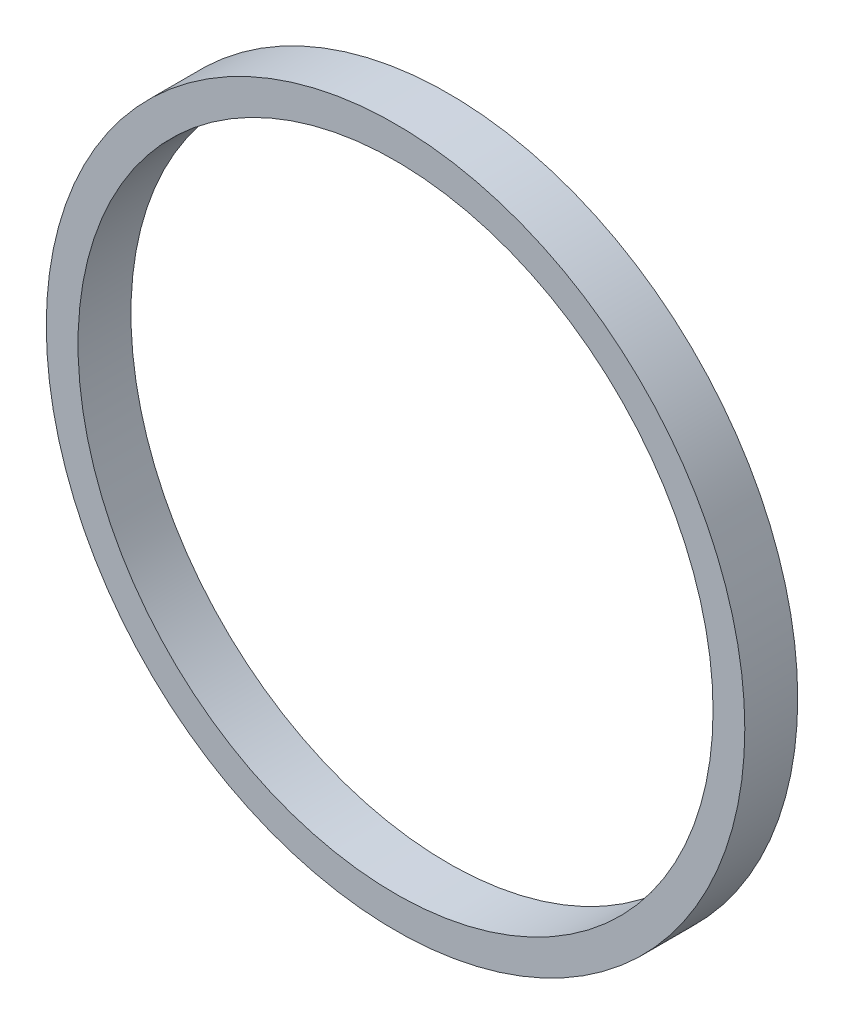
ISO-10303-21;
HEADER;
FILE_DESCRIPTION(('STEP AP214'),'2;1');
FILE_NAME('part.step','',(''),(''),'','','');
FILE_SCHEMA(('AUTOMOTIVE_DESIGN { 1 0 10303 214 1 1 1 1 }'));
ENDSEC;
DATA;
#1=APPLICATION_CONTEXT('core data for automotive mechanical design processes');
#2=APPLICATION_PROTOCOL_DEFINITION('international standard','automotive_design',2000,#1);
#3=PRODUCT_CONTEXT('',#1,'mechanical');
#4=PRODUCT('Part','Part','',(#3));
#5=PRODUCT_RELATED_PRODUCT_CATEGORY('part','',(#4));
#6=PRODUCT_DEFINITION_FORMATION('','',#4);
#7=PRODUCT_DEFINITION_CONTEXT('part definition',#1,'design');
#8=PRODUCT_DEFINITION('design','',#6,#7);
#9=PRODUCT_DEFINITION_SHAPE('','',#8);
#10=(LENGTH_UNIT() NAMED_UNIT(*) SI_UNIT(.MILLI.,.METRE.));
#11=(NAMED_UNIT(*) PLANE_ANGLE_UNIT() SI_UNIT($,.RADIAN.));
#12=(NAMED_UNIT(*) SI_UNIT($,.STERADIAN.) SOLID_ANGLE_UNIT());
#13=UNCERTAINTY_MEASURE_WITH_UNIT(LENGTH_MEASURE(1.E-05),#10,'distance_accuracy_value','');
#14=(GEOMETRIC_REPRESENTATION_CONTEXT(3) GLOBAL_UNCERTAINTY_ASSIGNED_CONTEXT((#13)) GLOBAL_UNIT_ASSIGNED_CONTEXT((#10,
#11,#12)) REPRESENTATION_CONTEXT('',''));
#15=CARTESIAN_POINT('',(0.,0.,0.));
#16=DIRECTION('',(0.,0.,1.));
#17=DIRECTION('',(1.,0.,0.));
#18=AXIS2_PLACEMENT_3D('',#15,#16,#17);
#19=CARTESIAN_POINT('',(-0.745995021380313,0.,5.));
#20=DIRECTION('',(0.,0.,1.));
#21=DIRECTION('',(1.,0.,0.));
#22=AXIS2_PLACEMENT_3D('',#19,#20,#21);
#23=PLANE('',#22);
#24=CARTESIAN_POINT('',(-0.745995021380313,0.,5.));
#25=DIRECTION('',(0.,0.,1.));
#26=DIRECTION('',(1.,0.,0.));
#27=AXIS2_PLACEMENT_3D('',#24,#25,#26);
#28=CIRCLE('',#27,33.);
#29=CARTESIAN_POINT('',(32.2540049786197,0.,5.));
#30=VERTEX_POINT('',#29);
#31=EDGE_CURVE('E10',#30,#30,#28,.T.);
#32=ORIENTED_EDGE('',*,*,#31,.T.);
#33=EDGE_LOOP('',(#32));
#34=FACE_BOUND('',#33,.T.);
#35=CARTESIAN_POINT('',(-0.745995021380313,0.,5.));
#36=DIRECTION('',(0.,0.,1.));
#37=DIRECTION('',(1.,0.,0.));
#38=AXIS2_PLACEMENT_3D('',#35,#36,#37);
#39=CIRCLE('',#38,30.);
#40=CARTESIAN_POINT('',(29.2540049786197,0.,5.));
#41=VERTEX_POINT('',#40);
#42=EDGE_CURVE('E48',#41,#41,#39,.T.);
#43=ORIENTED_EDGE('',*,*,#42,.F.);
#44=EDGE_LOOP('',(#43));
#45=FACE_BOUND('',#44,.T.);
#46=ADVANCED_FACE('F40',(#34,#45),#23,.T.);
#47=CARTESIAN_POINT('',(-0.745995021380313,0.,0.));
#48=DIRECTION('',(0.,0.,1.));
#49=DIRECTION('',(1.,0.,0.));
#50=AXIS2_PLACEMENT_3D('',#47,#48,#49);
#51=PLANE('',#50);
#52=CARTESIAN_POINT('',(-0.745995021380313,0.,0.));
#53=DIRECTION('',(0.,0.,1.));
#54=DIRECTION('',(1.,0.,0.));
#55=AXIS2_PLACEMENT_3D('',#52,#53,#54);
#56=CIRCLE('',#55,33.);
#57=CARTESIAN_POINT('',(32.2540049786197,0.,0.));
#58=VERTEX_POINT('',#57);
#59=EDGE_CURVE('E41',#58,#58,#56,.T.);
#60=ORIENTED_EDGE('',*,*,#59,.F.);
#61=EDGE_LOOP('',(#60));
#62=FACE_BOUND('',#61,.T.);
#63=CARTESIAN_POINT('',(-0.745995021380313,0.,0.));
#64=DIRECTION('',(0.,0.,1.));
#65=DIRECTION('',(1.,0.,0.));
#66=AXIS2_PLACEMENT_3D('',#63,#64,#65);
#67=CIRCLE('',#66,30.);
#68=CARTESIAN_POINT('',(29.2540049786197,0.,0.));
#69=VERTEX_POINT('',#68);
#70=EDGE_CURVE('E49',#69,#69,#67,.T.);
#71=ORIENTED_EDGE('',*,*,#70,.T.);
#72=EDGE_LOOP('',(#71));
#73=FACE_BOUND('',#72,.T.);
#74=ADVANCED_FACE('F58',(#62,#73),#51,.F.);
#75=CARTESIAN_POINT('',(-0.745995021380313,0.,5.));
#76=DIRECTION('',(0.,0.,-1.));
#77=DIRECTION('',(-1.,0.,0.));
#78=AXIS2_PLACEMENT_3D('',#75,#76,#77);
#79=CYLINDRICAL_SURFACE('',#78,33.);
#80=ORIENTED_EDGE('',*,*,#31,.F.);
#81=EDGE_LOOP('',(#80));
#82=FACE_BOUND('',#81,.T.);
#83=ORIENTED_EDGE('',*,*,#59,.T.);
#84=EDGE_LOOP('',(#83));
#85=FACE_BOUND('',#84,.T.);
#86=ADVANCED_FACE('F39',(#82,#85),#79,.T.);
#87=CARTESIAN_POINT('',(-0.745995021380313,0.,5.));
#88=DIRECTION('',(0.,0.,-1.));
#89=DIRECTION('',(-1.,0.,0.));
#90=AXIS2_PLACEMENT_3D('',#87,#88,#89);
#91=CYLINDRICAL_SURFACE('',#90,30.);
#92=ORIENTED_EDGE('',*,*,#42,.T.);
#93=EDGE_LOOP('',(#92));
#94=FACE_BOUND('',#93,.T.);
#95=ORIENTED_EDGE('',*,*,#70,.F.);
#96=EDGE_LOOP('',(#95));
#97=FACE_BOUND('',#96,.T.);
#98=ADVANCED_FACE('F57',(#94,#97),#91,.F.);
#99=CLOSED_SHELL('',(#46,#74,#86,#98));
#100=MANIFOLD_SOLID_BREP('B2',#99);
#101=ADVANCED_BREP_SHAPE_REPRESENTATION('',(#18,#100),#14);
#102=SHAPE_DEFINITION_REPRESENTATION(#9,#101);
ENDSEC;
END-ISO-10303-21;
